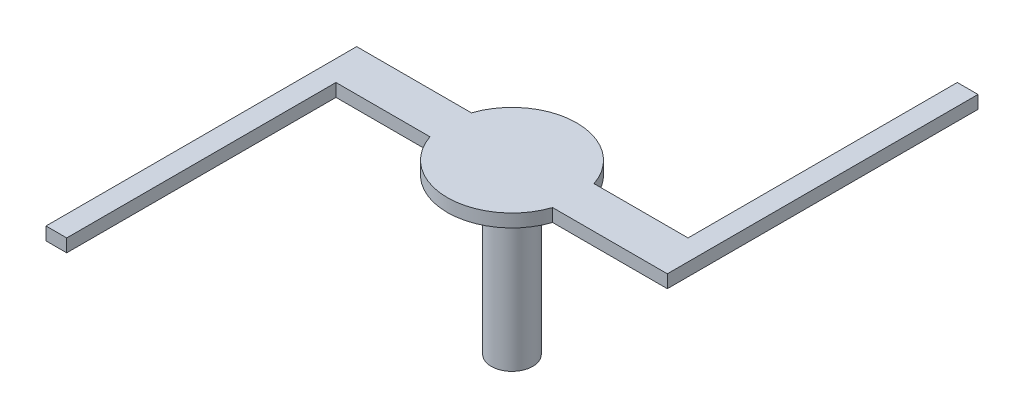
ISO-10303-21;
HEADER;
FILE_DESCRIPTION(('STEP AP214'),'2;1');
FILE_NAME('part.step','',(''),(''),'','','');
FILE_SCHEMA(('AUTOMOTIVE_DESIGN { 1 0 10303 214 1 1 1 1 }'));
ENDSEC;
DATA;
#1=APPLICATION_CONTEXT('core data for automotive mechanical design processes');
#2=APPLICATION_PROTOCOL_DEFINITION('international standard','automotive_design',2000,#1);
#3=PRODUCT_CONTEXT('',#1,'mechanical');
#4=PRODUCT('Part','Part','',(#3));
#5=PRODUCT_RELATED_PRODUCT_CATEGORY('part','',(#4));
#6=PRODUCT_DEFINITION_FORMATION('','',#4);
#7=PRODUCT_DEFINITION_CONTEXT('part definition',#1,'design');
#8=PRODUCT_DEFINITION('design','',#6,#7);
#9=PRODUCT_DEFINITION_SHAPE('','',#8);
#10=(LENGTH_UNIT() NAMED_UNIT(*) SI_UNIT(.MILLI.,.METRE.));
#11=(NAMED_UNIT(*) PLANE_ANGLE_UNIT() SI_UNIT($,.RADIAN.));
#12=(NAMED_UNIT(*) SI_UNIT($,.STERADIAN.) SOLID_ANGLE_UNIT());
#13=UNCERTAINTY_MEASURE_WITH_UNIT(LENGTH_MEASURE(1.E-05),#10,'distance_accuracy_value','');
#14=(GEOMETRIC_REPRESENTATION_CONTEXT(3) GLOBAL_UNCERTAINTY_ASSIGNED_CONTEXT((#13)) GLOBAL_UNIT_ASSIGNED_CONTEXT((#10,
#11,#12)) REPRESENTATION_CONTEXT('',''));
#15=CARTESIAN_POINT('',(0.,0.,0.));
#16=DIRECTION('',(0.,0.,1.));
#17=DIRECTION('',(1.,0.,0.));
#18=AXIS2_PLACEMENT_3D('',#15,#16,#17);
#19=CARTESIAN_POINT('',(0.,30.,0.));
#20=DIRECTION('',(0.,-1.,0.));
#21=DIRECTION('',(0.,0.,-1.));
#22=AXIS2_PLACEMENT_3D('',#19,#20,#21);
#23=CYLINDRICAL_SURFACE('',#22,4.);
#24=CARTESIAN_POINT('',(0.,30.,0.));
#25=DIRECTION('',(0.,1.,0.));
#26=DIRECTION('',(0.,0.,1.));
#27=AXIS2_PLACEMENT_3D('',#24,#25,#26);
#28=CIRCLE('',#27,4.);
#29=CARTESIAN_POINT('',(0.,30.,4.));
#30=VERTEX_POINT('',#29);
#31=EDGE_CURVE('E11',#30,#30,#28,.T.);
#32=ORIENTED_EDGE('',*,*,#31,.F.);
#33=EDGE_LOOP('',(#32));
#34=FACE_BOUND('',#33,.T.);
#35=CARTESIAN_POINT('',(0.,0.,0.));
#36=DIRECTION('',(0.,1.,0.));
#37=DIRECTION('',(0.,0.,1.));
#38=AXIS2_PLACEMENT_3D('',#35,#36,#37);
#39=CIRCLE('',#38,4.);
#40=CARTESIAN_POINT('',(0.,0.,4.));
#41=VERTEX_POINT('',#40);
#42=EDGE_CURVE('E42',#41,#41,#39,.T.);
#43=ORIENTED_EDGE('',*,*,#42,.T.);
#44=EDGE_LOOP('',(#43));
#45=FACE_BOUND('',#44,.T.);
#46=ADVANCED_FACE('F39',(#34,#45),#23,.T.);
#47=CARTESIAN_POINT('',(0.,0.,0.));
#48=DIRECTION('',(0.,1.,0.));
#49=DIRECTION('',(0.,0.,1.));
#50=AXIS2_PLACEMENT_3D('',#47,#48,#49);
#51=PLANE('',#50);
#52=ORIENTED_EDGE('',*,*,#42,.F.);
#53=EDGE_LOOP('',(#52));
#54=FACE_BOUND('',#53,.T.);
#55=ADVANCED_FACE('F213',(#54),#51,.F.);
#56=CARTESIAN_POINT('',(30.,32.5,-56.));
#57=DIRECTION('',(0.,0.,1.));
#58=DIRECTION('',(1.,0.,0.));
#59=AXIS2_PLACEMENT_3D('',#56,#57,#58);
#60=PLANE('',#59);
#61=DIRECTION('',(-1.,0.,0.));
#62=VECTOR('',#61,1.);
#63=CARTESIAN_POINT('',(30.,30.,-56.));
#64=LINE('',#63,#62);
#65=CARTESIAN_POINT('',(34.,30.,-56.));
#66=VERTEX_POINT('',#65);
#67=CARTESIAN_POINT('',(30.,30.,-56.));
#68=VERTEX_POINT('',#67);
#69=EDGE_CURVE('E160',#66,#68,#64,.T.);
#70=ORIENTED_EDGE('',*,*,#69,.T.);
#71=DIRECTION('',(0.,-1.,0.));
#72=VECTOR('',#71,1.);
#73=CARTESIAN_POINT('',(30.,32.5,-56.));
#74=LINE('',#73,#72);
#75=CARTESIAN_POINT('',(30.,32.5,-56.));
#76=VERTEX_POINT('',#75);
#77=EDGE_CURVE('E207',#76,#68,#74,.T.);
#78=ORIENTED_EDGE('',*,*,#77,.F.);
#79=DIRECTION('',(-1.,0.,0.));
#80=VECTOR('',#79,1.);
#81=CARTESIAN_POINT('',(30.,32.5,-56.));
#82=LINE('',#81,#80);
#83=CARTESIAN_POINT('',(34.,32.5,-56.));
#84=VERTEX_POINT('',#83);
#85=EDGE_CURVE('E182',#84,#76,#82,.T.);
#86=ORIENTED_EDGE('',*,*,#85,.F.);
#87=DIRECTION('',(0.,-1.,0.));
#88=VECTOR('',#87,1.);
#89=CARTESIAN_POINT('',(34.,32.5,-56.));
#90=LINE('',#89,#88);
#91=EDGE_CURVE('E156',#84,#66,#90,.T.);
#92=ORIENTED_EDGE('',*,*,#91,.T.);
#93=EDGE_LOOP('',(#70,#78,#86,#92));
#94=FACE_BOUND('',#93,.T.);
#95=ADVANCED_FACE('F215',(#94),#60,.F.);
#96=CARTESIAN_POINT('',(30.,32.5,-4.00000000000001));
#97=DIRECTION('',(1.,0.,0.));
#98=DIRECTION('',(0.,0.,-1.));
#99=AXIS2_PLACEMENT_3D('',#96,#97,#98);
#100=PLANE('',#99);
#101=DIRECTION('',(0.,0.,1.));
#102=VECTOR('',#101,1.);
#103=CARTESIAN_POINT('',(30.,30.,-4.00000000000001));
#104=LINE('',#103,#102);
#105=CARTESIAN_POINT('',(30.,30.,-4.00000000000001));
#106=VERTEX_POINT('',#105);
#107=EDGE_CURVE('E163',#68,#106,#104,.T.);
#108=ORIENTED_EDGE('',*,*,#107,.T.);
#109=DIRECTION('',(0.,-1.,0.));
#110=VECTOR('',#109,1.);
#111=CARTESIAN_POINT('',(30.,32.5,-4.00000000000001));
#112=LINE('',#111,#110);
#113=CARTESIAN_POINT('',(30.,32.5,-4.00000000000001));
#114=VERTEX_POINT('',#113);
#115=EDGE_CURVE('E204',#114,#106,#112,.T.);
#116=ORIENTED_EDGE('',*,*,#115,.F.);
#117=DIRECTION('',(0.,0.,1.));
#118=VECTOR('',#117,1.);
#119=CARTESIAN_POINT('',(30.,32.5,-4.00000000000001));
#120=LINE('',#119,#118);
#121=EDGE_CURVE('E111',#76,#114,#120,.T.);
#122=ORIENTED_EDGE('',*,*,#121,.F.);
#123=ORIENTED_EDGE('',*,*,#77,.T.);
#124=EDGE_LOOP('',(#108,#116,#122,#123));
#125=FACE_BOUND('',#124,.T.);
#126=ADVANCED_FACE('F220',(#125),#100,.F.);
#127=CARTESIAN_POINT('',(30.,32.5,-4.00000000000001));
#128=DIRECTION('',(0.,0.,1.));
#129=DIRECTION('',(1.,0.,0.));
#130=AXIS2_PLACEMENT_3D('',#127,#128,#129);
#131=PLANE('',#130);
#132=DIRECTION('',(-1.,0.,0.));
#133=VECTOR('',#132,1.);
#134=CARTESIAN_POINT('',(30.,30.,-4.00000000000001));
#135=LINE('',#134,#133);
#136=CARTESIAN_POINT('',(11.842719282327,30.,-4.));
#137=VERTEX_POINT('',#136);
#138=EDGE_CURVE('E165',#106,#137,#135,.T.);
#139=ORIENTED_EDGE('',*,*,#138,.T.);
#140=DIRECTION('',(0.,-1.,0.));
#141=VECTOR('',#140,1.);
#142=CARTESIAN_POINT('',(11.842719282327,32.5,-4.));
#143=LINE('',#142,#141);
#144=CARTESIAN_POINT('',(11.842719282327,32.5,-4.));
#145=VERTEX_POINT('',#144);
#146=EDGE_CURVE('E201',#145,#137,#143,.T.);
#147=ORIENTED_EDGE('',*,*,#146,.F.);
#148=DIRECTION('',(-1.,0.,0.));
#149=VECTOR('',#148,1.);
#150=CARTESIAN_POINT('',(30.,32.5,-4.00000000000001));
#151=LINE('',#150,#149);
#152=EDGE_CURVE('E431',#114,#145,#151,.T.);
#153=ORIENTED_EDGE('',*,*,#152,.F.);
#154=ORIENTED_EDGE('',*,*,#115,.T.);
#155=EDGE_LOOP('',(#139,#147,#153,#154));
#156=FACE_BOUND('',#155,.T.);
#157=ADVANCED_FACE('F227',(#156),#131,.F.);
#158=CARTESIAN_POINT('',(0.,32.5,0.));
#159=DIRECTION('',(0.,-1.,0.));
#160=DIRECTION('',(0.,0.,-1.));
#161=AXIS2_PLACEMENT_3D('',#158,#159,#160);
#162=CYLINDRICAL_SURFACE('',#161,12.5);
#163=CARTESIAN_POINT('',(0.,30.,0.));
#164=DIRECTION('',(0.,1.,0.));
#165=DIRECTION('',(0.,0.,1.));
#166=AXIS2_PLACEMENT_3D('',#163,#164,#165);
#167=CIRCLE('',#166,12.5);
#168=CARTESIAN_POINT('',(-11.842719282327,30.,-4.));
#169=VERTEX_POINT('',#168);
#170=EDGE_CURVE('E167',#137,#169,#167,.T.);
#171=ORIENTED_EDGE('',*,*,#170,.T.);
#172=DIRECTION('',(0.,-1.,0.));
#173=VECTOR('',#172,1.);
#174=CARTESIAN_POINT('',(-11.842719282327,32.5,-4.));
#175=LINE('',#174,#173);
#176=CARTESIAN_POINT('',(-11.842719282327,32.5,-4.));
#177=VERTEX_POINT('',#176);
#178=EDGE_CURVE('E198',#177,#169,#175,.T.);
#179=ORIENTED_EDGE('',*,*,#178,.F.);
#180=CARTESIAN_POINT('',(0.,32.5,0.));
#181=DIRECTION('',(0.,1.,0.));
#182=DIRECTION('',(0.,0.,1.));
#183=AXIS2_PLACEMENT_3D('',#180,#181,#182);
#184=CIRCLE('',#183,12.5);
#185=EDGE_CURVE('E435',#145,#177,#184,.T.);
#186=ORIENTED_EDGE('',*,*,#185,.F.);
#187=ORIENTED_EDGE('',*,*,#146,.T.);
#188=EDGE_LOOP('',(#171,#179,#186,#187));
#189=FACE_BOUND('',#188,.T.);
#190=ADVANCED_FACE('F230',(#189),#162,.T.);
#191=CARTESIAN_POINT('',(-11.842719282327,32.5,-4.));
#192=DIRECTION('',(0.,0.,1.));
#193=DIRECTION('',(1.,0.,0.));
#194=AXIS2_PLACEMENT_3D('',#191,#192,#193);
#195=PLANE('',#194);
#196=DIRECTION('',(-1.,0.,0.));
#197=VECTOR('',#196,1.);
#198=CARTESIAN_POINT('',(-11.842719282327,30.,-4.));
#199=LINE('',#198,#197);
#200=CARTESIAN_POINT('',(-34.,30.,-4.));
#201=VERTEX_POINT('',#200);
#202=EDGE_CURVE('E169',#169,#201,#199,.T.);
#203=ORIENTED_EDGE('',*,*,#202,.T.);
#204=DIRECTION('',(0.,-1.,0.));
#205=VECTOR('',#204,1.);
#206=CARTESIAN_POINT('',(-34.,32.5,-4.));
#207=LINE('',#206,#205);
#208=CARTESIAN_POINT('',(-34.,32.5,-4.));
#209=VERTEX_POINT('',#208);
#210=EDGE_CURVE('E195',#209,#201,#207,.T.);
#211=ORIENTED_EDGE('',*,*,#210,.F.);
#212=DIRECTION('',(-1.,0.,0.));
#213=VECTOR('',#212,1.);
#214=CARTESIAN_POINT('',(-11.842719282327,32.5,-4.));
#215=LINE('',#214,#213);
#216=EDGE_CURVE('E437',#177,#209,#215,.T.);
#217=ORIENTED_EDGE('',*,*,#216,.F.);
#218=ORIENTED_EDGE('',*,*,#178,.T.);
#219=EDGE_LOOP('',(#203,#211,#217,#218));
#220=FACE_BOUND('',#219,.T.);
#221=ADVANCED_FACE('F234',(#220),#195,.F.);
#222=CARTESIAN_POINT('',(-34.,32.5,-4.));
#223=DIRECTION('',(1.,0.,0.));
#224=DIRECTION('',(0.,0.,-1.));
#225=AXIS2_PLACEMENT_3D('',#222,#223,#224);
#226=PLANE('',#225);
#227=DIRECTION('',(0.,0.,1.));
#228=VECTOR('',#227,1.);
#229=CARTESIAN_POINT('',(-34.,30.,-4.));
#230=LINE('',#229,#228);
#231=CARTESIAN_POINT('',(-34.,30.,56.));
#232=VERTEX_POINT('',#231);
#233=EDGE_CURVE('E171',#201,#232,#230,.T.);
#234=ORIENTED_EDGE('',*,*,#233,.T.);
#235=DIRECTION('',(0.,-1.,0.));
#236=VECTOR('',#235,1.);
#237=CARTESIAN_POINT('',(-34.,32.5,56.));
#238=LINE('',#237,#236);
#239=CARTESIAN_POINT('',(-34.,32.5,56.));
#240=VERTEX_POINT('',#239);
#241=EDGE_CURVE('E192',#240,#232,#238,.T.);
#242=ORIENTED_EDGE('',*,*,#241,.F.);
#243=DIRECTION('',(0.,0.,1.));
#244=VECTOR('',#243,1.);
#245=CARTESIAN_POINT('',(-34.,32.5,-4.));
#246=LINE('',#245,#244);
#247=EDGE_CURVE('E439',#209,#240,#246,.T.);
#248=ORIENTED_EDGE('',*,*,#247,.F.);
#249=ORIENTED_EDGE('',*,*,#210,.T.);
#250=EDGE_LOOP('',(#234,#242,#248,#249));
#251=FACE_BOUND('',#250,.T.);
#252=ADVANCED_FACE('F238',(#251),#226,.F.);
#253=CARTESIAN_POINT('',(-34.,32.5,56.));
#254=DIRECTION('',(0.,0.,-1.));
#255=DIRECTION('',(-1.,0.,0.));
#256=AXIS2_PLACEMENT_3D('',#253,#254,#255);
#257=PLANE('',#256);
#258=DIRECTION('',(1.,0.,0.));
#259=VECTOR('',#258,1.);
#260=CARTESIAN_POINT('',(-34.,30.,56.));
#261=LINE('',#260,#259);
#262=CARTESIAN_POINT('',(-30.,30.,56.));
#263=VERTEX_POINT('',#262);
#264=EDGE_CURVE('E173',#232,#263,#261,.T.);
#265=ORIENTED_EDGE('',*,*,#264,.T.);
#266=DIRECTION('',(0.,-1.,0.));
#267=VECTOR('',#266,1.);
#268=CARTESIAN_POINT('',(-30.,32.5,56.));
#269=LINE('',#268,#267);
#270=CARTESIAN_POINT('',(-30.,32.5,56.));
#271=VERTEX_POINT('',#270);
#272=EDGE_CURVE('E189',#271,#263,#269,.T.);
#273=ORIENTED_EDGE('',*,*,#272,.F.);
#274=DIRECTION('',(1.,0.,0.));
#275=VECTOR('',#274,1.);
#276=CARTESIAN_POINT('',(-34.,32.5,56.));
#277=LINE('',#276,#275);
#278=EDGE_CURVE('E441',#240,#271,#277,.T.);
#279=ORIENTED_EDGE('',*,*,#278,.F.);
#280=ORIENTED_EDGE('',*,*,#241,.T.);
#281=EDGE_LOOP('',(#265,#273,#279,#280));
#282=FACE_BOUND('',#281,.T.);
#283=ADVANCED_FACE('F242',(#282),#257,.F.);
#284=CARTESIAN_POINT('',(-30.,32.5,4.));
#285=DIRECTION('',(-1.,0.,0.));
#286=DIRECTION('',(0.,0.,1.));
#287=AXIS2_PLACEMENT_3D('',#284,#285,#286);
#288=PLANE('',#287);
#289=DIRECTION('',(0.,0.,-1.));
#290=VECTOR('',#289,1.);
#291=CARTESIAN_POINT('',(-30.,30.,4.));
#292=LINE('',#291,#290);
#293=CARTESIAN_POINT('',(-30.,30.,4.));
#294=VERTEX_POINT('',#293);
#295=EDGE_CURVE('E175',#263,#294,#292,.T.);
#296=ORIENTED_EDGE('',*,*,#295,.T.);
#297=DIRECTION('',(0.,-1.,0.));
#298=VECTOR('',#297,1.);
#299=CARTESIAN_POINT('',(-30.,32.5,4.));
#300=LINE('',#299,#298);
#301=CARTESIAN_POINT('',(-30.,32.5,4.));
#302=VERTEX_POINT('',#301);
#303=EDGE_CURVE('E186',#302,#294,#300,.T.);
#304=ORIENTED_EDGE('',*,*,#303,.F.);
#305=DIRECTION('',(0.,0.,-1.));
#306=VECTOR('',#305,1.);
#307=CARTESIAN_POINT('',(-30.,32.5,4.));
#308=LINE('',#307,#306);
#309=EDGE_CURVE('E443',#271,#302,#308,.T.);
#310=ORIENTED_EDGE('',*,*,#309,.F.);
#311=ORIENTED_EDGE('',*,*,#272,.T.);
#312=EDGE_LOOP('',(#296,#304,#310,#311));
#313=FACE_BOUND('',#312,.T.);
#314=ADVANCED_FACE('F246',(#313),#288,.F.);
#315=CARTESIAN_POINT('',(-11.842719282327,32.5,4.));
#316=DIRECTION('',(0.,0.,-1.));
#317=DIRECTION('',(-1.,0.,0.));
#318=AXIS2_PLACEMENT_3D('',#315,#316,#317);
#319=PLANE('',#318);
#320=DIRECTION('',(1.,0.,0.));
#321=VECTOR('',#320,1.);
#322=CARTESIAN_POINT('',(-11.842719282327,30.,4.));
#323=LINE('',#322,#321);
#324=CARTESIAN_POINT('',(-11.842719282327,30.,4.));
#325=VERTEX_POINT('',#324);
#326=EDGE_CURVE('E177',#294,#325,#323,.T.);
#327=ORIENTED_EDGE('',*,*,#326,.T.);
#328=DIRECTION('',(0.,-1.,0.));
#329=VECTOR('',#328,1.);
#330=CARTESIAN_POINT('',(-11.842719282327,32.5,4.));
#331=LINE('',#330,#329);
#332=CARTESIAN_POINT('',(-11.842719282327,32.5,4.));
#333=VERTEX_POINT('',#332);
#334=EDGE_CURVE('E151',#333,#325,#331,.T.);
#335=ORIENTED_EDGE('',*,*,#334,.F.);
#336=DIRECTION('',(1.,0.,0.));
#337=VECTOR('',#336,1.);
#338=CARTESIAN_POINT('',(-11.842719282327,32.5,4.));
#339=LINE('',#338,#337);
#340=EDGE_CURVE('E142',#302,#333,#339,.T.);
#341=ORIENTED_EDGE('',*,*,#340,.F.);
#342=ORIENTED_EDGE('',*,*,#303,.T.);
#343=EDGE_LOOP('',(#327,#335,#341,#342));
#344=FACE_BOUND('',#343,.T.);
#345=ADVANCED_FACE('F250',(#344),#319,.F.);
#346=CARTESIAN_POINT('',(0.,32.5,0.));
#347=DIRECTION('',(0.,-1.,0.));
#348=DIRECTION('',(0.,0.,-1.));
#349=AXIS2_PLACEMENT_3D('',#346,#347,#348);
#350=CYLINDRICAL_SURFACE('',#349,12.5);
#351=CARTESIAN_POINT('',(0.,30.,0.));
#352=DIRECTION('',(0.,1.,0.));
#353=DIRECTION('',(0.,0.,1.));
#354=AXIS2_PLACEMENT_3D('',#351,#352,#353);
#355=CIRCLE('',#354,12.5);
#356=CARTESIAN_POINT('',(11.842719282327,30.,4.));
#357=VERTEX_POINT('',#356);
#358=EDGE_CURVE('E150',#325,#357,#355,.T.);
#359=ORIENTED_EDGE('',*,*,#358,.T.);
#360=DIRECTION('',(0.,-1.,0.));
#361=VECTOR('',#360,1.);
#362=CARTESIAN_POINT('',(11.842719282327,32.5,4.));
#363=LINE('',#362,#361);
#364=CARTESIAN_POINT('',(11.842719282327,32.5,4.));
#365=VERTEX_POINT('',#364);
#366=EDGE_CURVE('E147',#365,#357,#363,.T.);
#367=ORIENTED_EDGE('',*,*,#366,.F.);
#368=CARTESIAN_POINT('',(0.,32.5,0.));
#369=DIRECTION('',(0.,1.,0.));
#370=DIRECTION('',(0.,0.,1.));
#371=AXIS2_PLACEMENT_3D('',#368,#369,#370);
#372=CIRCLE('',#371,12.5);
#373=EDGE_CURVE('E136',#333,#365,#372,.T.);
#374=ORIENTED_EDGE('',*,*,#373,.F.);
#375=ORIENTED_EDGE('',*,*,#334,.T.);
#376=EDGE_LOOP('',(#359,#367,#374,#375));
#377=FACE_BOUND('',#376,.T.);
#378=ADVANCED_FACE('F148',(#377),#350,.T.);
#379=CARTESIAN_POINT('',(34.,32.5,4.));
#380=DIRECTION('',(0.,0.,-1.));
#381=DIRECTION('',(-1.,0.,0.));
#382=AXIS2_PLACEMENT_3D('',#379,#380,#381);
#383=PLANE('',#382);
#384=DIRECTION('',(1.,0.,0.));
#385=VECTOR('',#384,1.);
#386=CARTESIAN_POINT('',(34.,30.,4.));
#387=LINE('',#386,#385);
#388=CARTESIAN_POINT('',(34.,30.,4.));
#389=VERTEX_POINT('',#388);
#390=EDGE_CURVE('E96',#357,#389,#387,.T.);
#391=ORIENTED_EDGE('',*,*,#390,.T.);
#392=DIRECTION('',(0.,-1.,0.));
#393=VECTOR('',#392,1.);
#394=CARTESIAN_POINT('',(34.,32.5,4.));
#395=LINE('',#394,#393);
#396=CARTESIAN_POINT('',(34.,32.5,4.));
#397=VERTEX_POINT('',#396);
#398=EDGE_CURVE('E152',#397,#389,#395,.T.);
#399=ORIENTED_EDGE('',*,*,#398,.F.);
#400=DIRECTION('',(1.,0.,0.));
#401=VECTOR('',#400,1.);
#402=CARTESIAN_POINT('',(34.,32.5,4.));
#403=LINE('',#402,#401);
#404=EDGE_CURVE('E140',#365,#397,#403,.T.);
#405=ORIENTED_EDGE('',*,*,#404,.F.);
#406=ORIENTED_EDGE('',*,*,#366,.T.);
#407=EDGE_LOOP('',(#391,#399,#405,#406));
#408=FACE_BOUND('',#407,.T.);
#409=ADVANCED_FACE('F154',(#408),#383,.F.);
#410=CARTESIAN_POINT('',(34.,32.5,4.));
#411=DIRECTION('',(-1.,0.,0.));
#412=DIRECTION('',(0.,0.,1.));
#413=AXIS2_PLACEMENT_3D('',#410,#411,#412);
#414=PLANE('',#413);
#415=DIRECTION('',(0.,0.,-1.));
#416=VECTOR('',#415,1.);
#417=CARTESIAN_POINT('',(34.,30.,4.));
#418=LINE('',#417,#416);
#419=EDGE_CURVE('E102',#389,#66,#418,.T.);
#420=ORIENTED_EDGE('',*,*,#419,.T.);
#421=ORIENTED_EDGE('',*,*,#91,.F.);
#422=DIRECTION('',(0.,0.,-1.));
#423=VECTOR('',#422,1.);
#424=CARTESIAN_POINT('',(34.,32.5,4.));
#425=LINE('',#424,#423);
#426=EDGE_CURVE('E55',#397,#84,#425,.T.);
#427=ORIENTED_EDGE('',*,*,#426,.F.);
#428=ORIENTED_EDGE('',*,*,#398,.T.);
#429=EDGE_LOOP('',(#420,#421,#427,#428));
#430=FACE_BOUND('',#429,.T.);
#431=ADVANCED_FACE('F259',(#430),#414,.F.);
#432=CARTESIAN_POINT('',(0.,32.5,0.));
#433=DIRECTION('',(0.,1.,0.));
#434=DIRECTION('',(0.,0.,1.));
#435=AXIS2_PLACEMENT_3D('',#432,#433,#434);
#436=PLANE('',#435);
#437=ORIENTED_EDGE('',*,*,#85,.T.);
#438=ORIENTED_EDGE('',*,*,#121,.T.);
#439=ORIENTED_EDGE('',*,*,#152,.T.);
#440=ORIENTED_EDGE('',*,*,#185,.T.);
#441=ORIENTED_EDGE('',*,*,#216,.T.);
#442=ORIENTED_EDGE('',*,*,#247,.T.);
#443=ORIENTED_EDGE('',*,*,#278,.T.);
#444=ORIENTED_EDGE('',*,*,#309,.T.);
#445=ORIENTED_EDGE('',*,*,#340,.T.);
#446=ORIENTED_EDGE('',*,*,#373,.T.);
#447=ORIENTED_EDGE('',*,*,#404,.T.);
#448=ORIENTED_EDGE('',*,*,#426,.T.);
#449=EDGE_LOOP('',(#437,#438,#439,#440,#441,#442,#443,#444,#445,#446,#447,#448));
#450=FACE_BOUND('',#449,.T.);
#451=ADVANCED_FACE('F138',(#450),#436,.T.);
#452=CARTESIAN_POINT('',(0.,30.,0.));
#453=DIRECTION('',(0.,1.,0.));
#454=DIRECTION('',(0.,0.,1.));
#455=AXIS2_PLACEMENT_3D('',#452,#453,#454);
#456=PLANE('',#455);
#457=ORIENTED_EDGE('',*,*,#31,.T.);
#458=EDGE_LOOP('',(#457));
#459=FACE_BOUND('',#458,.T.);
#460=ORIENTED_EDGE('',*,*,#69,.F.);
#461=ORIENTED_EDGE('',*,*,#419,.F.);
#462=ORIENTED_EDGE('',*,*,#390,.F.);
#463=ORIENTED_EDGE('',*,*,#358,.F.);
#464=ORIENTED_EDGE('',*,*,#326,.F.);
#465=ORIENTED_EDGE('',*,*,#295,.F.);
#466=ORIENTED_EDGE('',*,*,#264,.F.);
#467=ORIENTED_EDGE('',*,*,#233,.F.);
#468=ORIENTED_EDGE('',*,*,#202,.F.);
#469=ORIENTED_EDGE('',*,*,#170,.F.);
#470=ORIENTED_EDGE('',*,*,#138,.F.);
#471=ORIENTED_EDGE('',*,*,#107,.F.);
#472=EDGE_LOOP('',(#460,#461,#462,#463,#464,#465,#466,#467,#468,#469,#470,#471));
#473=FACE_BOUND('',#472,.T.);
#474=ADVANCED_FACE('F262',(#459,#473),#456,.F.);
#475=CLOSED_SHELL('',(#46,#55,#95,#126,#157,#190,#221,#252,#283,#314,#345,#378,#409,#431,#451,#474));
#476=MANIFOLD_SOLID_BREP('B2',#475);
#477=ADVANCED_BREP_SHAPE_REPRESENTATION('',(#18,#476),#14);
#478=SHAPE_DEFINITION_REPRESENTATION(#9,#477);
ENDSEC;
END-ISO-10303-21;
